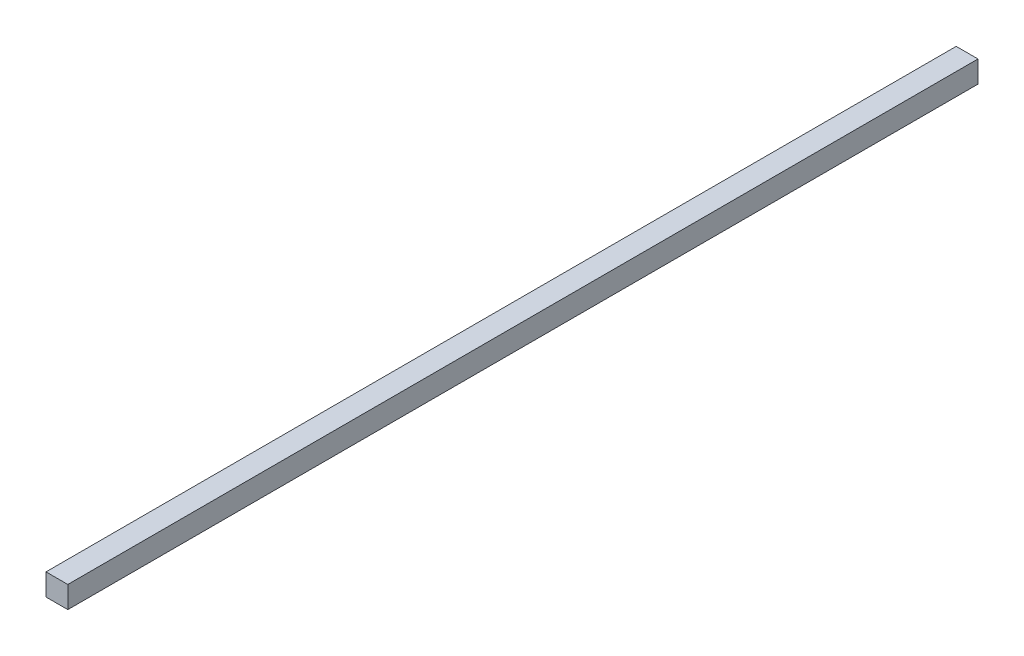
ISO-10303-21;
HEADER;
FILE_DESCRIPTION(('STEP AP214'),'2;1');
FILE_NAME('part.step','',(''),(''),'','','');
FILE_SCHEMA(('AUTOMOTIVE_DESIGN { 1 0 10303 214 1 1 1 1 }'));
ENDSEC;
DATA;
#1=APPLICATION_CONTEXT('core data for automotive mechanical design processes');
#2=APPLICATION_PROTOCOL_DEFINITION('international standard','automotive_design',2000,#1);
#3=PRODUCT_CONTEXT('',#1,'mechanical');
#4=PRODUCT('Part','Part','',(#3));
#5=PRODUCT_RELATED_PRODUCT_CATEGORY('part','',(#4));
#6=PRODUCT_DEFINITION_FORMATION('','',#4);
#7=PRODUCT_DEFINITION_CONTEXT('part definition',#1,'design');
#8=PRODUCT_DEFINITION('design','',#6,#7);
#9=PRODUCT_DEFINITION_SHAPE('','',#8);
#10=(LENGTH_UNIT() NAMED_UNIT(*) SI_UNIT(.MILLI.,.METRE.));
#11=(NAMED_UNIT(*) PLANE_ANGLE_UNIT() SI_UNIT($,.RADIAN.));
#12=(NAMED_UNIT(*) SI_UNIT($,.STERADIAN.) SOLID_ANGLE_UNIT());
#13=UNCERTAINTY_MEASURE_WITH_UNIT(LENGTH_MEASURE(1.E-05),#10,'distance_accuracy_value','');
#14=(GEOMETRIC_REPRESENTATION_CONTEXT(3) GLOBAL_UNCERTAINTY_ASSIGNED_CONTEXT((#13)) GLOBAL_UNIT_ASSIGNED_CONTEXT((#10,
#11,#12)) REPRESENTATION_CONTEXT('',''));
#15=CARTESIAN_POINT('',(0.,0.,0.));
#16=DIRECTION('',(0.,0.,1.));
#17=DIRECTION('',(1.,0.,0.));
#18=AXIS2_PLACEMENT_3D('',#15,#16,#17);
#19=CARTESIAN_POINT('',(-3.175,-3.175,132.5));
#20=DIRECTION('',(1.,0.,0.));
#21=DIRECTION('',(0.,1.,0.));
#22=AXIS2_PLACEMENT_3D('',#19,#20,#21);
#23=PLANE('',#22);
#24=DIRECTION('',(0.,-1.,0.));
#25=VECTOR('',#24,1.);
#26=CARTESIAN_POINT('',(-3.175,-3.175,-132.5));
#27=LINE('',#26,#25);
#28=CARTESIAN_POINT('',(-3.175,3.175,-132.5));
#29=VERTEX_POINT('',#28);
#30=CARTESIAN_POINT('',(-3.175,-3.175,-132.5));
#31=VERTEX_POINT('',#30);
#32=EDGE_CURVE('E109',#29,#31,#27,.T.);
#33=ORIENTED_EDGE('',*,*,#32,.T.);
#34=DIRECTION('',(0.,0.,-1.));
#35=VECTOR('',#34,1.);
#36=CARTESIAN_POINT('',(-3.175,-3.175,132.5));
#37=LINE('',#36,#35);
#38=CARTESIAN_POINT('',(-3.175,-3.175,132.5));
#39=VERTEX_POINT('',#38);
#40=EDGE_CURVE('E11',#39,#31,#37,.T.);
#41=ORIENTED_EDGE('',*,*,#40,.F.);
#42=DIRECTION('',(0.,-1.,0.));
#43=VECTOR('',#42,1.);
#44=CARTESIAN_POINT('',(-3.175,-3.175,132.5));
#45=LINE('',#44,#43);
#46=CARTESIAN_POINT('',(-3.175,3.175,132.5));
#47=VERTEX_POINT('',#46);
#48=EDGE_CURVE('E93',#47,#39,#45,.T.);
#49=ORIENTED_EDGE('',*,*,#48,.F.);
#50=DIRECTION('',(0.,0.,-1.));
#51=VECTOR('',#50,1.);
#52=CARTESIAN_POINT('',(-3.175,3.175,132.5));
#53=LINE('',#52,#51);
#54=EDGE_CURVE('E105',#47,#29,#53,.T.);
#55=ORIENTED_EDGE('',*,*,#54,.T.);
#56=EDGE_LOOP('',(#33,#41,#49,#55));
#57=FACE_BOUND('',#56,.T.);
#58=ADVANCED_FACE('F41',(#57),#23,.F.);
#59=CARTESIAN_POINT('',(3.175,-3.175,132.5));
#60=DIRECTION('',(0.,1.,0.));
#61=DIRECTION('',(-1.,0.,0.));
#62=AXIS2_PLACEMENT_3D('',#59,#60,#61);
#63=PLANE('',#62);
#64=DIRECTION('',(1.,0.,0.));
#65=VECTOR('',#64,1.);
#66=CARTESIAN_POINT('',(3.175,-3.175,-132.5));
#67=LINE('',#66,#65);
#68=CARTESIAN_POINT('',(3.175,-3.175,-132.5));
#69=VERTEX_POINT('',#68);
#70=EDGE_CURVE('E98',#31,#69,#67,.T.);
#71=ORIENTED_EDGE('',*,*,#70,.T.);
#72=DIRECTION('',(0.,0.,-1.));
#73=VECTOR('',#72,1.);
#74=CARTESIAN_POINT('',(3.175,-3.175,132.5));
#75=LINE('',#74,#73);
#76=CARTESIAN_POINT('',(3.175,-3.175,132.5));
#77=VERTEX_POINT('',#76);
#78=EDGE_CURVE('E50',#77,#69,#75,.T.);
#79=ORIENTED_EDGE('',*,*,#78,.F.);
#80=DIRECTION('',(1.,0.,0.));
#81=VECTOR('',#80,1.);
#82=CARTESIAN_POINT('',(3.175,-3.175,132.5));
#83=LINE('',#82,#81);
#84=EDGE_CURVE('E88',#39,#77,#83,.T.);
#85=ORIENTED_EDGE('',*,*,#84,.F.);
#86=ORIENTED_EDGE('',*,*,#40,.T.);
#87=EDGE_LOOP('',(#71,#79,#85,#86));
#88=FACE_BOUND('',#87,.T.);
#89=ADVANCED_FACE('F97',(#88),#63,.F.);
#90=CARTESIAN_POINT('',(3.175,3.175,132.5));
#91=DIRECTION('',(-1.,0.,0.));
#92=DIRECTION('',(0.,-1.,0.));
#93=AXIS2_PLACEMENT_3D('',#90,#91,#92);
#94=PLANE('',#93);
#95=DIRECTION('',(0.,1.,0.));
#96=VECTOR('',#95,1.);
#97=CARTESIAN_POINT('',(3.175,3.175,-132.5));
#98=LINE('',#97,#96);
#99=CARTESIAN_POINT('',(3.175,3.175,-132.5));
#100=VERTEX_POINT('',#99);
#101=EDGE_CURVE('E75',#69,#100,#98,.T.);
#102=ORIENTED_EDGE('',*,*,#101,.T.);
#103=DIRECTION('',(0.,0.,-1.));
#104=VECTOR('',#103,1.);
#105=CARTESIAN_POINT('',(3.175,3.175,132.5));
#106=LINE('',#105,#104);
#107=CARTESIAN_POINT('',(3.175,3.175,132.5));
#108=VERTEX_POINT('',#107);
#109=EDGE_CURVE('E100',#108,#100,#106,.T.);
#110=ORIENTED_EDGE('',*,*,#109,.F.);
#111=DIRECTION('',(0.,1.,0.));
#112=VECTOR('',#111,1.);
#113=CARTESIAN_POINT('',(3.175,3.175,132.5));
#114=LINE('',#113,#112);
#115=EDGE_CURVE('E91',#77,#108,#114,.T.);
#116=ORIENTED_EDGE('',*,*,#115,.F.);
#117=ORIENTED_EDGE('',*,*,#78,.T.);
#118=EDGE_LOOP('',(#102,#110,#116,#117));
#119=FACE_BOUND('',#118,.T.);
#120=ADVANCED_FACE('F101',(#119),#94,.F.);
#121=CARTESIAN_POINT('',(-3.175,3.175,132.5));
#122=DIRECTION('',(0.,-1.,0.));
#123=DIRECTION('',(1.,0.,0.));
#124=AXIS2_PLACEMENT_3D('',#121,#122,#123);
#125=PLANE('',#124);
#126=DIRECTION('',(-1.,0.,0.));
#127=VECTOR('',#126,1.);
#128=CARTESIAN_POINT('',(-3.175,3.175,-132.5));
#129=LINE('',#128,#127);
#130=EDGE_CURVE('E81',#100,#29,#129,.T.);
#131=ORIENTED_EDGE('',*,*,#130,.T.);
#132=ORIENTED_EDGE('',*,*,#54,.F.);
#133=DIRECTION('',(-1.,0.,0.));
#134=VECTOR('',#133,1.);
#135=CARTESIAN_POINT('',(-3.175,3.175,132.5));
#136=LINE('',#135,#134);
#137=EDGE_CURVE('E58',#108,#47,#136,.T.);
#138=ORIENTED_EDGE('',*,*,#137,.F.);
#139=ORIENTED_EDGE('',*,*,#109,.T.);
#140=EDGE_LOOP('',(#131,#132,#138,#139));
#141=FACE_BOUND('',#140,.T.);
#142=ADVANCED_FACE('F122',(#141),#125,.F.);
#143=CARTESIAN_POINT('',(0.,0.,132.5));
#144=DIRECTION('',(0.,0.,-1.));
#145=DIRECTION('',(-1.,0.,0.));
#146=AXIS2_PLACEMENT_3D('',#143,#144,#145);
#147=PLANE('',#146);
#148=ORIENTED_EDGE('',*,*,#48,.T.);
#149=ORIENTED_EDGE('',*,*,#84,.T.);
#150=ORIENTED_EDGE('',*,*,#115,.T.);
#151=ORIENTED_EDGE('',*,*,#137,.T.);
#152=EDGE_LOOP('',(#148,#149,#150,#151));
#153=FACE_BOUND('',#152,.T.);
#154=ADVANCED_FACE('F89',(#153),#147,.F.);
#155=CARTESIAN_POINT('',(0.,0.,-132.5));
#156=DIRECTION('',(0.,0.,-1.));
#157=DIRECTION('',(-1.,0.,0.));
#158=AXIS2_PLACEMENT_3D('',#155,#156,#157);
#159=PLANE('',#158);
#160=ORIENTED_EDGE('',*,*,#32,.F.);
#161=ORIENTED_EDGE('',*,*,#130,.F.);
#162=ORIENTED_EDGE('',*,*,#101,.F.);
#163=ORIENTED_EDGE('',*,*,#70,.F.);
#164=EDGE_LOOP('',(#160,#161,#162,#163));
#165=FACE_BOUND('',#164,.T.);
#166=ADVANCED_FACE('F125',(#165),#159,.T.);
#167=CLOSED_SHELL('',(#58,#89,#120,#142,#154,#166));
#168=MANIFOLD_SOLID_BREP('B2',#167);
#169=ADVANCED_BREP_SHAPE_REPRESENTATION('',(#18,#168),#14);
#170=SHAPE_DEFINITION_REPRESENTATION(#9,#169);
ENDSEC;
END-ISO-10303-21;
